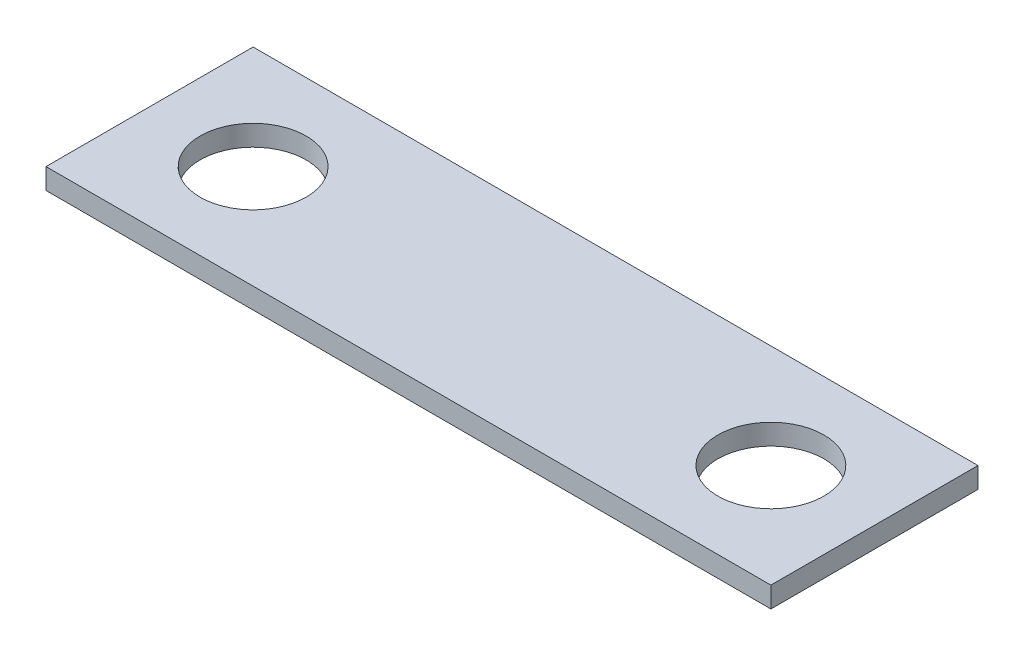
ISO-10303-21;
HEADER;
FILE_DESCRIPTION(('STEP AP214'),'2;1');
FILE_NAME('part.step','',(''),(''),'','','');
FILE_SCHEMA(('AUTOMOTIVE_DESIGN { 1 0 10303 214 1 1 1 1 }'));
ENDSEC;
DATA;
#1=APPLICATION_CONTEXT('core data for automotive mechanical design processes');
#2=APPLICATION_PROTOCOL_DEFINITION('international standard','automotive_design',2000,#1);
#3=PRODUCT_CONTEXT('',#1,'mechanical');
#4=PRODUCT('Part','Part','',(#3));
#5=PRODUCT_RELATED_PRODUCT_CATEGORY('part','',(#4));
#6=PRODUCT_DEFINITION_FORMATION('','',#4);
#7=PRODUCT_DEFINITION_CONTEXT('part definition',#1,'design');
#8=PRODUCT_DEFINITION('design','',#6,#7);
#9=PRODUCT_DEFINITION_SHAPE('','',#8);
#10=(LENGTH_UNIT() NAMED_UNIT(*) SI_UNIT(.MILLI.,.METRE.));
#11=(NAMED_UNIT(*) PLANE_ANGLE_UNIT() SI_UNIT($,.RADIAN.));
#12=(NAMED_UNIT(*) SI_UNIT($,.STERADIAN.) SOLID_ANGLE_UNIT());
#13=UNCERTAINTY_MEASURE_WITH_UNIT(LENGTH_MEASURE(1.E-05),#10,'distance_accuracy_value','');
#14=(GEOMETRIC_REPRESENTATION_CONTEXT(3) GLOBAL_UNCERTAINTY_ASSIGNED_CONTEXT((#13)) GLOBAL_UNIT_ASSIGNED_CONTEXT((#10,
#11,#12)) REPRESENTATION_CONTEXT('',''));
#15=CARTESIAN_POINT('',(0.,0.,0.));
#16=DIRECTION('',(0.,0.,1.));
#17=DIRECTION('',(1.,0.,0.));
#18=AXIS2_PLACEMENT_3D('',#15,#16,#17);
#19=CARTESIAN_POINT('',(0.,1.27,0.));
#20=DIRECTION('',(0.,-1.,0.));
#21=DIRECTION('',(0.,0.,-1.));
#22=AXIS2_PLACEMENT_3D('',#19,#20,#21);
#23=PLANE('',#22);
#24=DIRECTION('',(0.,0.,1.));
#25=VECTOR('',#24,1.);
#26=CARTESIAN_POINT('',(0.,1.27,0.));
#27=LINE('',#26,#25);
#28=CARTESIAN_POINT('',(0.,1.27,-12.7));
#29=VERTEX_POINT('',#28);
#30=CARTESIAN_POINT('',(0.,1.27,0.));
#31=VERTEX_POINT('',#30);
#32=EDGE_CURVE('E84',#29,#31,#27,.T.);
#33=ORIENTED_EDGE('',*,*,#32,.T.);
#34=DIRECTION('',(1.,0.,0.));
#35=VECTOR('',#34,1.);
#36=CARTESIAN_POINT('',(0.,1.27,0.));
#37=LINE('',#36,#35);
#38=CARTESIAN_POINT('',(44.45,1.27,0.));
#39=VERTEX_POINT('',#38);
#40=EDGE_CURVE('E79',#31,#39,#37,.T.);
#41=ORIENTED_EDGE('',*,*,#40,.T.);
#42=DIRECTION('',(0.,0.,-1.));
#43=VECTOR('',#42,1.);
#44=CARTESIAN_POINT('',(44.45,1.27,0.));
#45=LINE('',#44,#43);
#46=CARTESIAN_POINT('',(44.45,1.27,-12.7));
#47=VERTEX_POINT('',#46);
#48=EDGE_CURVE('E82',#39,#47,#45,.T.);
#49=ORIENTED_EDGE('',*,*,#48,.T.);
#50=DIRECTION('',(-1.,0.,0.));
#51=VECTOR('',#50,1.);
#52=CARTESIAN_POINT('',(0.,1.27,-12.7));
#53=LINE('',#52,#51);
#54=EDGE_CURVE('E49',#47,#29,#53,.T.);
#55=ORIENTED_EDGE('',*,*,#54,.T.);
#56=EDGE_LOOP('',(#33,#41,#49,#55));
#57=FACE_BOUND('',#56,.T.);
#58=CARTESIAN_POINT('',(6.35,1.27,-6.35));
#59=DIRECTION('',(0.,1.,0.));
#60=DIRECTION('',(0.,0.,1.));
#61=AXIS2_PLACEMENT_3D('',#58,#59,#60);
#62=CIRCLE('',#61,3.2512);
#63=CARTESIAN_POINT('',(6.35,1.27,-3.0988));
#64=VERTEX_POINT('',#63);
#65=EDGE_CURVE('E99',#64,#64,#62,.T.);
#66=ORIENTED_EDGE('',*,*,#65,.F.);
#67=EDGE_LOOP('',(#66));
#68=FACE_BOUND('',#67,.T.);
#69=CARTESIAN_POINT('',(38.1,1.27,-6.35));
#70=DIRECTION('',(0.,1.,0.));
#71=DIRECTION('',(0.,0.,-1.));
#72=AXIS2_PLACEMENT_3D('',#69,#70,#71);
#73=CIRCLE('',#72,3.2512);
#74=CARTESIAN_POINT('',(38.1,1.27,-9.6012));
#75=VERTEX_POINT('',#74);
#76=EDGE_CURVE('E114',#75,#75,#73,.T.);
#77=ORIENTED_EDGE('',*,*,#76,.F.);
#78=EDGE_LOOP('',(#77));
#79=FACE_BOUND('',#78,.T.);
#80=ADVANCED_FACE('F32',(#57,#68,#79),#23,.F.);
#81=CARTESIAN_POINT('',(0.,0.,0.));
#82=DIRECTION('',(0.,-1.,0.));
#83=DIRECTION('',(0.,0.,-1.));
#84=AXIS2_PLACEMENT_3D('',#81,#82,#83);
#85=PLANE('',#84);
#86=CARTESIAN_POINT('',(6.35,0.,-6.35));
#87=DIRECTION('',(0.,1.,0.));
#88=DIRECTION('',(0.,0.,1.));
#89=AXIS2_PLACEMENT_3D('',#86,#87,#88);
#90=CIRCLE('',#89,3.2512);
#91=CARTESIAN_POINT('',(6.35,0.,-3.0988));
#92=VERTEX_POINT('',#91);
#93=EDGE_CURVE('E111',#92,#92,#90,.T.);
#94=ORIENTED_EDGE('',*,*,#93,.T.);
#95=EDGE_LOOP('',(#94));
#96=FACE_BOUND('',#95,.T.);
#97=DIRECTION('',(0.,0.,1.));
#98=VECTOR('',#97,1.);
#99=CARTESIAN_POINT('',(0.,0.,0.));
#100=LINE('',#99,#98);
#101=CARTESIAN_POINT('',(0.,0.,-12.7));
#102=VERTEX_POINT('',#101);
#103=CARTESIAN_POINT('',(0.,0.,0.));
#104=VERTEX_POINT('',#103);
#105=EDGE_CURVE('E96',#102,#104,#100,.T.);
#106=ORIENTED_EDGE('',*,*,#105,.F.);
#107=DIRECTION('',(-1.,0.,0.));
#108=VECTOR('',#107,1.);
#109=CARTESIAN_POINT('',(0.,0.,-12.7));
#110=LINE('',#109,#108);
#111=CARTESIAN_POINT('',(44.45,0.,-12.7));
#112=VERTEX_POINT('',#111);
#113=EDGE_CURVE('E72',#112,#102,#110,.T.);
#114=ORIENTED_EDGE('',*,*,#113,.F.);
#115=DIRECTION('',(0.,0.,-1.));
#116=VECTOR('',#115,1.);
#117=CARTESIAN_POINT('',(44.45,0.,0.));
#118=LINE('',#117,#116);
#119=CARTESIAN_POINT('',(44.45,0.,0.));
#120=VERTEX_POINT('',#119);
#121=EDGE_CURVE('E66',#120,#112,#118,.T.);
#122=ORIENTED_EDGE('',*,*,#121,.F.);
#123=DIRECTION('',(1.,0.,0.));
#124=VECTOR('',#123,1.);
#125=CARTESIAN_POINT('',(0.,0.,0.));
#126=LINE('',#125,#124);
#127=EDGE_CURVE('E88',#104,#120,#126,.T.);
#128=ORIENTED_EDGE('',*,*,#127,.F.);
#129=EDGE_LOOP('',(#106,#114,#122,#128));
#130=FACE_BOUND('',#129,.T.);
#131=CARTESIAN_POINT('',(38.1,0.,-6.35));
#132=DIRECTION('',(0.,1.,0.));
#133=DIRECTION('',(0.,0.,-1.));
#134=AXIS2_PLACEMENT_3D('',#131,#132,#133);
#135=CIRCLE('',#134,3.2512);
#136=CARTESIAN_POINT('',(38.1,0.,-9.6012));
#137=VERTEX_POINT('',#136);
#138=EDGE_CURVE('E117',#137,#137,#135,.T.);
#139=ORIENTED_EDGE('',*,*,#138,.T.);
#140=EDGE_LOOP('',(#139));
#141=FACE_BOUND('',#140,.T.);
#142=ADVANCED_FACE('F107',(#96,#130,#141),#85,.T.);
#143=CARTESIAN_POINT('',(0.,1.27,0.));
#144=DIRECTION('',(1.,0.,0.));
#145=DIRECTION('',(0.,0.,-1.));
#146=AXIS2_PLACEMENT_3D('',#143,#144,#145);
#147=PLANE('',#146);
#148=ORIENTED_EDGE('',*,*,#105,.T.);
#149=DIRECTION('',(0.,-1.,0.));
#150=VECTOR('',#149,1.);
#151=CARTESIAN_POINT('',(0.,1.27,0.));
#152=LINE('',#151,#150);
#153=EDGE_CURVE('E11',#31,#104,#152,.T.);
#154=ORIENTED_EDGE('',*,*,#153,.F.);
#155=ORIENTED_EDGE('',*,*,#32,.F.);
#156=DIRECTION('',(0.,-1.,0.));
#157=VECTOR('',#156,1.);
#158=CARTESIAN_POINT('',(0.,1.27,-12.7));
#159=LINE('',#158,#157);
#160=EDGE_CURVE('E92',#29,#102,#159,.T.);
#161=ORIENTED_EDGE('',*,*,#160,.T.);
#162=EDGE_LOOP('',(#148,#154,#155,#161));
#163=FACE_BOUND('',#162,.T.);
#164=ADVANCED_FACE('F34',(#163),#147,.F.);
#165=CARTESIAN_POINT('',(0.,1.27,0.));
#166=DIRECTION('',(0.,0.,-1.));
#167=DIRECTION('',(-1.,0.,0.));
#168=AXIS2_PLACEMENT_3D('',#165,#166,#167);
#169=PLANE('',#168);
#170=ORIENTED_EDGE('',*,*,#127,.T.);
#171=DIRECTION('',(0.,-1.,0.));
#172=VECTOR('',#171,1.);
#173=CARTESIAN_POINT('',(44.45,1.27,0.));
#174=LINE('',#173,#172);
#175=EDGE_CURVE('E41',#39,#120,#174,.T.);
#176=ORIENTED_EDGE('',*,*,#175,.F.);
#177=ORIENTED_EDGE('',*,*,#40,.F.);
#178=ORIENTED_EDGE('',*,*,#153,.T.);
#179=EDGE_LOOP('',(#170,#176,#177,#178));
#180=FACE_BOUND('',#179,.T.);
#181=ADVANCED_FACE('F87',(#180),#169,.F.);
#182=CARTESIAN_POINT('',(44.45,1.27,0.));
#183=DIRECTION('',(-1.,0.,0.));
#184=DIRECTION('',(0.,0.,1.));
#185=AXIS2_PLACEMENT_3D('',#182,#183,#184);
#186=PLANE('',#185);
#187=ORIENTED_EDGE('',*,*,#121,.T.);
#188=DIRECTION('',(0.,-1.,0.));
#189=VECTOR('',#188,1.);
#190=CARTESIAN_POINT('',(44.45,1.27,-12.7));
#191=LINE('',#190,#189);
#192=EDGE_CURVE('E89',#47,#112,#191,.T.);
#193=ORIENTED_EDGE('',*,*,#192,.F.);
#194=ORIENTED_EDGE('',*,*,#48,.F.);
#195=ORIENTED_EDGE('',*,*,#175,.T.);
#196=EDGE_LOOP('',(#187,#193,#194,#195));
#197=FACE_BOUND('',#196,.T.);
#198=ADVANCED_FACE('F90',(#197),#186,.F.);
#199=CARTESIAN_POINT('',(0.,1.27,-12.7));
#200=DIRECTION('',(0.,0.,1.));
#201=DIRECTION('',(1.,0.,0.));
#202=AXIS2_PLACEMENT_3D('',#199,#200,#201);
#203=PLANE('',#202);
#204=ORIENTED_EDGE('',*,*,#113,.T.);
#205=ORIENTED_EDGE('',*,*,#160,.F.);
#206=ORIENTED_EDGE('',*,*,#54,.F.);
#207=ORIENTED_EDGE('',*,*,#192,.T.);
#208=EDGE_LOOP('',(#204,#205,#206,#207));
#209=FACE_BOUND('',#208,.T.);
#210=ADVANCED_FACE('F104',(#209),#203,.F.);
#211=CARTESIAN_POINT('',(6.35,1.27,-6.35));
#212=DIRECTION('',(0.,-1.,0.));
#213=DIRECTION('',(0.,0.,-1.));
#214=AXIS2_PLACEMENT_3D('',#211,#212,#213);
#215=CYLINDRICAL_SURFACE('',#214,3.2512);
#216=ORIENTED_EDGE('',*,*,#65,.T.);
#217=EDGE_LOOP('',(#216));
#218=FACE_BOUND('',#217,.T.);
#219=ORIENTED_EDGE('',*,*,#93,.F.);
#220=EDGE_LOOP('',(#219));
#221=FACE_BOUND('',#220,.T.);
#222=ADVANCED_FACE('F134',(#218,#221),#215,.F.);
#223=CARTESIAN_POINT('',(38.1,1.27,-6.35));
#224=DIRECTION('',(0.,-1.,0.));
#225=DIRECTION('',(0.,0.,-1.));
#226=AXIS2_PLACEMENT_3D('',#223,#224,#225);
#227=CYLINDRICAL_SURFACE('',#226,3.2512);
#228=ORIENTED_EDGE('',*,*,#76,.T.);
#229=EDGE_LOOP('',(#228));
#230=FACE_BOUND('',#229,.T.);
#231=ORIENTED_EDGE('',*,*,#138,.F.);
#232=EDGE_LOOP('',(#231));
#233=FACE_BOUND('',#232,.T.);
#234=ADVANCED_FACE('F123',(#230,#233),#227,.F.);
#235=CLOSED_SHELL('',(#80,#142,#164,#181,#198,#210,#222,#234));
#236=MANIFOLD_SOLID_BREP('B2',#235);
#237=ADVANCED_BREP_SHAPE_REPRESENTATION('',(#18,#236),#14);
#238=SHAPE_DEFINITION_REPRESENTATION(#9,#237);
ENDSEC;
END-ISO-10303-21;
